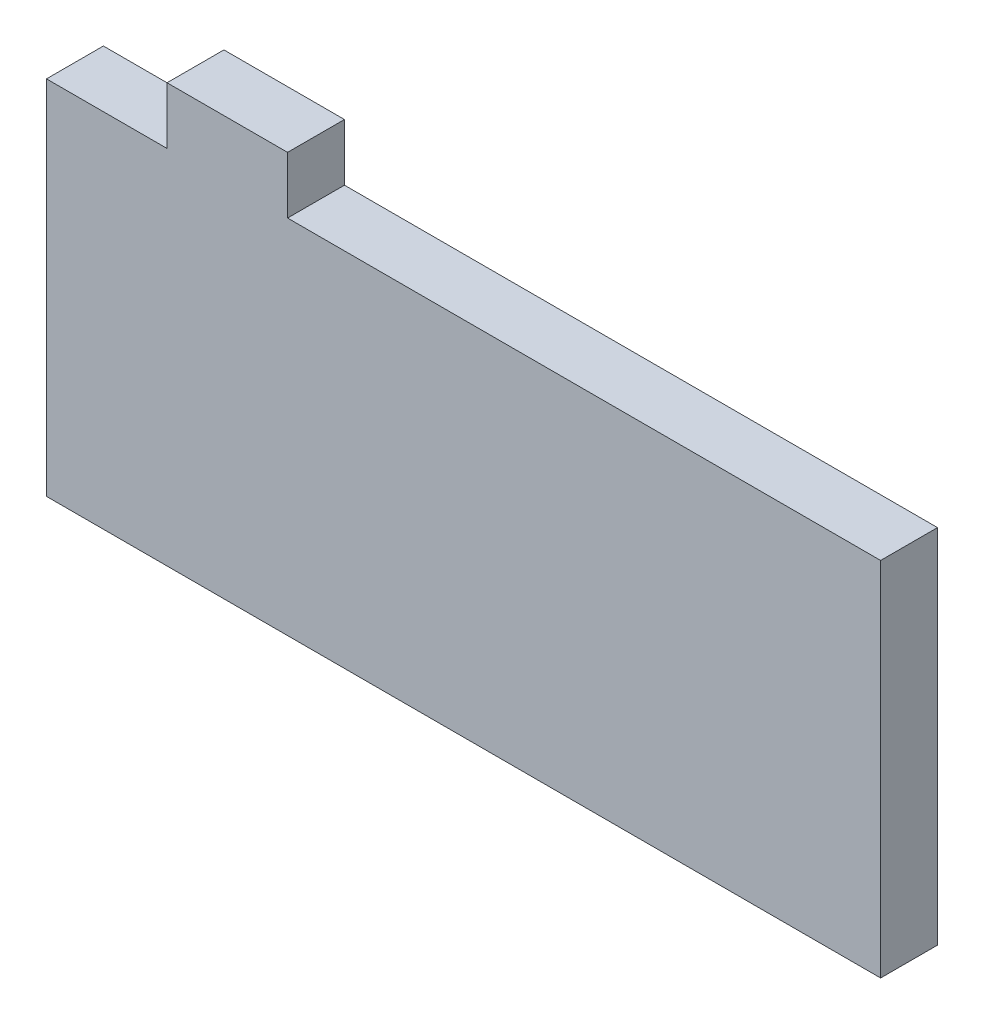
ISO-10303-21;
HEADER;
FILE_DESCRIPTION(('STEP AP214'),'2;1');
FILE_NAME('part.step','',(''),(''),'','','');
FILE_SCHEMA(('AUTOMOTIVE_DESIGN { 1 0 10303 214 1 1 1 1 }'));
ENDSEC;
DATA;
#1=APPLICATION_CONTEXT('core data for automotive mechanical design processes');
#2=APPLICATION_PROTOCOL_DEFINITION('international standard','automotive_design',2000,#1);
#3=PRODUCT_CONTEXT('',#1,'mechanical');
#4=PRODUCT('Part','Part','',(#3));
#5=PRODUCT_RELATED_PRODUCT_CATEGORY('part','',(#4));
#6=PRODUCT_DEFINITION_FORMATION('','',#4);
#7=PRODUCT_DEFINITION_CONTEXT('part definition',#1,'design');
#8=PRODUCT_DEFINITION('design','',#6,#7);
#9=PRODUCT_DEFINITION_SHAPE('','',#8);
#10=(LENGTH_UNIT() NAMED_UNIT(*) SI_UNIT(.MILLI.,.METRE.));
#11=(NAMED_UNIT(*) PLANE_ANGLE_UNIT() SI_UNIT($,.RADIAN.));
#12=(NAMED_UNIT(*) SI_UNIT($,.STERADIAN.) SOLID_ANGLE_UNIT());
#13=UNCERTAINTY_MEASURE_WITH_UNIT(LENGTH_MEASURE(1.E-05),#10,'distance_accuracy_value','');
#14=(GEOMETRIC_REPRESENTATION_CONTEXT(3) GLOBAL_UNCERTAINTY_ASSIGNED_CONTEXT((#13)) GLOBAL_UNIT_ASSIGNED_CONTEXT((#10,
#11,#12)) REPRESENTATION_CONTEXT('',''));
#15=CARTESIAN_POINT('',(0.,0.,0.));
#16=DIRECTION('',(0.,0.,1.));
#17=DIRECTION('',(1.,0.,0.));
#18=AXIS2_PLACEMENT_3D('',#15,#16,#17);
#19=CARTESIAN_POINT('',(-21.971,9.525,2.9972));
#20=DIRECTION('',(0.,-1.,0.));
#21=DIRECTION('',(0.,0.,-1.));
#22=AXIS2_PLACEMENT_3D('',#19,#20,#21);
#23=PLANE('',#22);
#24=DIRECTION('',(0.,0.,1.));
#25=VECTOR('',#24,1.);
#26=CARTESIAN_POINT('',(-15.621,9.525,0.));
#27=LINE('',#26,#25);
#28=CARTESIAN_POINT('',(-15.621,9.525,0.));
#29=VERTEX_POINT('',#28);
#30=CARTESIAN_POINT('',(-15.621,9.525,2.9972));
#31=VERTEX_POINT('',#30);
#32=EDGE_CURVE('E132',#29,#31,#27,.T.);
#33=ORIENTED_EDGE('',*,*,#32,.F.);
#34=DIRECTION('',(-1.,0.,0.));
#35=VECTOR('',#34,1.);
#36=CARTESIAN_POINT('',(-21.971,9.525,0.));
#37=LINE('',#36,#35);
#38=CARTESIAN_POINT('',(-21.971,9.525,0.));
#39=VERTEX_POINT('',#38);
#40=EDGE_CURVE('E136',#29,#39,#37,.T.);
#41=ORIENTED_EDGE('',*,*,#40,.T.);
#42=DIRECTION('',(0.,0.,-1.));
#43=VECTOR('',#42,1.);
#44=CARTESIAN_POINT('',(-21.971,9.525,2.9972));
#45=LINE('',#44,#43);
#46=CARTESIAN_POINT('',(-21.971,9.525,2.9972));
#47=VERTEX_POINT('',#46);
#48=EDGE_CURVE('E53',#47,#39,#45,.T.);
#49=ORIENTED_EDGE('',*,*,#48,.F.);
#50=DIRECTION('',(-1.,0.,0.));
#51=VECTOR('',#50,1.);
#52=CARTESIAN_POINT('',(-21.971,9.525,2.9972));
#53=LINE('',#52,#51);
#54=EDGE_CURVE('E60',#31,#47,#53,.T.);
#55=ORIENTED_EDGE('',*,*,#54,.F.);
#56=EDGE_LOOP('',(#33,#41,#49,#55));
#57=FACE_BOUND('',#56,.T.);
#58=ADVANCED_FACE('F45',(#57),#23,.F.);
#59=DIRECTION('',(0.,0.,-1.));
#60=VECTOR('',#59,1.);
#61=CARTESIAN_POINT('',(-9.271,9.525,0.));
#62=LINE('',#61,#60);
#63=CARTESIAN_POINT('',(-9.271,9.525,2.9972));
#64=VERTEX_POINT('',#63);
#65=CARTESIAN_POINT('',(-9.271,9.525,0.));
#66=VERTEX_POINT('',#65);
#67=EDGE_CURVE('E68',#64,#66,#62,.T.);
#68=ORIENTED_EDGE('',*,*,#67,.F.);
#69=CARTESIAN_POINT('',(21.971,9.525,2.9972));
#70=VERTEX_POINT('',#69);
#71=EDGE_CURVE('E145',#70,#64,#53,.T.);
#72=ORIENTED_EDGE('',*,*,#71,.F.);
#73=DIRECTION('',(0.,0.,-1.));
#74=VECTOR('',#73,1.);
#75=CARTESIAN_POINT('',(21.971,9.525,2.9972));
#76=LINE('',#75,#74);
#77=CARTESIAN_POINT('',(21.971,9.525,0.));
#78=VERTEX_POINT('',#77);
#79=EDGE_CURVE('E11',#70,#78,#76,.T.);
#80=ORIENTED_EDGE('',*,*,#79,.T.);
#81=EDGE_CURVE('E152',#78,#66,#37,.T.);
#82=ORIENTED_EDGE('',*,*,#81,.T.);
#83=EDGE_LOOP('',(#68,#72,#80,#82));
#84=FACE_BOUND('',#83,.T.);
#85=ADVANCED_FACE('F189',(#84),#23,.F.);
#86=CARTESIAN_POINT('',(21.971,-9.525,2.9972));
#87=DIRECTION('',(-1.,0.,0.));
#88=DIRECTION('',(0.,0.,1.));
#89=AXIS2_PLACEMENT_3D('',#86,#87,#88);
#90=PLANE('',#89);
#91=DIRECTION('',(0.,1.,0.));
#92=VECTOR('',#91,1.);
#93=CARTESIAN_POINT('',(21.971,-9.525,0.));
#94=LINE('',#93,#92);
#95=CARTESIAN_POINT('',(21.971,-9.525,0.));
#96=VERTEX_POINT('',#95);
#97=EDGE_CURVE('E133',#96,#78,#94,.T.);
#98=ORIENTED_EDGE('',*,*,#97,.T.);
#99=ORIENTED_EDGE('',*,*,#79,.F.);
#100=DIRECTION('',(0.,1.,0.));
#101=VECTOR('',#100,1.);
#102=CARTESIAN_POINT('',(21.971,-9.525,2.9972));
#103=LINE('',#102,#101);
#104=CARTESIAN_POINT('',(21.971,-9.525,2.9972));
#105=VERTEX_POINT('',#104);
#106=EDGE_CURVE('E142',#105,#70,#103,.T.);
#107=ORIENTED_EDGE('',*,*,#106,.F.);
#108=DIRECTION('',(0.,0.,-1.));
#109=VECTOR('',#108,1.);
#110=CARTESIAN_POINT('',(21.971,-9.525,2.9972));
#111=LINE('',#110,#109);
#112=EDGE_CURVE('E150',#105,#96,#111,.T.);
#113=ORIENTED_EDGE('',*,*,#112,.T.);
#114=EDGE_LOOP('',(#98,#99,#107,#113));
#115=FACE_BOUND('',#114,.T.);
#116=ADVANCED_FACE('F47',(#115),#90,.F.);
#117=CARTESIAN_POINT('',(-21.971,-9.525,2.9972));
#118=DIRECTION('',(1.,0.,0.));
#119=DIRECTION('',(0.,0.,-1.));
#120=AXIS2_PLACEMENT_3D('',#117,#118,#119);
#121=PLANE('',#120);
#122=DIRECTION('',(0.,-1.,0.));
#123=VECTOR('',#122,1.);
#124=CARTESIAN_POINT('',(-21.971,-9.525,0.));
#125=LINE('',#124,#123);
#126=CARTESIAN_POINT('',(-21.971,-9.525,0.));
#127=VERTEX_POINT('',#126);
#128=EDGE_CURVE('E154',#39,#127,#125,.T.);
#129=ORIENTED_EDGE('',*,*,#128,.T.);
#130=DIRECTION('',(0.,0.,-1.));
#131=VECTOR('',#130,1.);
#132=CARTESIAN_POINT('',(-21.971,-9.525,2.9972));
#133=LINE('',#132,#131);
#134=CARTESIAN_POINT('',(-21.971,-9.525,2.9972));
#135=VERTEX_POINT('',#134);
#136=EDGE_CURVE('E159',#135,#127,#133,.T.);
#137=ORIENTED_EDGE('',*,*,#136,.F.);
#138=DIRECTION('',(0.,-1.,0.));
#139=VECTOR('',#138,1.);
#140=CARTESIAN_POINT('',(-21.971,-9.525,2.9972));
#141=LINE('',#140,#139);
#142=EDGE_CURVE('E147',#47,#135,#141,.T.);
#143=ORIENTED_EDGE('',*,*,#142,.F.);
#144=ORIENTED_EDGE('',*,*,#48,.T.);
#145=EDGE_LOOP('',(#129,#137,#143,#144));
#146=FACE_BOUND('',#145,.T.);
#147=ADVANCED_FACE('F165',(#146),#121,.F.);
#148=CARTESIAN_POINT('',(-21.971,-9.525,2.9972));
#149=DIRECTION('',(0.,1.,0.));
#150=DIRECTION('',(0.,0.,1.));
#151=AXIS2_PLACEMENT_3D('',#148,#149,#150);
#152=PLANE('',#151);
#153=DIRECTION('',(1.,0.,0.));
#154=VECTOR('',#153,1.);
#155=CARTESIAN_POINT('',(-21.971,-9.525,0.));
#156=LINE('',#155,#154);
#157=EDGE_CURVE('E144',#127,#96,#156,.T.);
#158=ORIENTED_EDGE('',*,*,#157,.T.);
#159=ORIENTED_EDGE('',*,*,#112,.F.);
#160=DIRECTION('',(1.,0.,0.));
#161=VECTOR('',#160,1.);
#162=CARTESIAN_POINT('',(-21.971,-9.525,2.9972));
#163=LINE('',#162,#161);
#164=EDGE_CURVE('E149',#135,#105,#163,.T.);
#165=ORIENTED_EDGE('',*,*,#164,.F.);
#166=ORIENTED_EDGE('',*,*,#136,.T.);
#167=EDGE_LOOP('',(#158,#159,#165,#166));
#168=FACE_BOUND('',#167,.T.);
#169=ADVANCED_FACE('F174',(#168),#152,.F.);
#170=CARTESIAN_POINT('',(0.,0.,2.9972));
#171=DIRECTION('',(0.,0.,-1.));
#172=DIRECTION('',(-1.,0.,0.));
#173=AXIS2_PLACEMENT_3D('',#170,#171,#172);
#174=PLANE('',#173);
#175=ORIENTED_EDGE('',*,*,#106,.T.);
#176=ORIENTED_EDGE('',*,*,#71,.T.);
#177=DIRECTION('',(0.,-1.,0.));
#178=VECTOR('',#177,1.);
#179=CARTESIAN_POINT('',(-9.271,12.5222,2.9972));
#180=LINE('',#179,#178);
#181=CARTESIAN_POINT('',(-9.271,12.5222,2.9972));
#182=VERTEX_POINT('',#181);
#183=EDGE_CURVE('E117',#182,#64,#180,.T.);
#184=ORIENTED_EDGE('',*,*,#183,.F.);
#185=DIRECTION('',(1.,0.,0.));
#186=VECTOR('',#185,1.);
#187=CARTESIAN_POINT('',(-15.621,12.5222,2.9972));
#188=LINE('',#187,#186);
#189=CARTESIAN_POINT('',(-15.621,12.5222,2.9972));
#190=VERTEX_POINT('',#189);
#191=EDGE_CURVE('E109',#190,#182,#188,.T.);
#192=ORIENTED_EDGE('',*,*,#191,.F.);
#193=DIRECTION('',(0.,-1.,0.));
#194=VECTOR('',#193,1.);
#195=CARTESIAN_POINT('',(-15.621,12.5222,2.9972));
#196=LINE('',#195,#194);
#197=EDGE_CURVE('E114',#190,#31,#196,.T.);
#198=ORIENTED_EDGE('',*,*,#197,.T.);
#199=ORIENTED_EDGE('',*,*,#54,.T.);
#200=ORIENTED_EDGE('',*,*,#142,.T.);
#201=ORIENTED_EDGE('',*,*,#164,.T.);
#202=EDGE_LOOP('',(#175,#176,#184,#192,#198,#199,#200,#201));
#203=FACE_BOUND('',#202,.T.);
#204=ADVANCED_FACE('F112',(#203),#174,.F.);
#205=CARTESIAN_POINT('',(0.,0.,0.));
#206=DIRECTION('',(0.,0.,-1.));
#207=DIRECTION('',(-1.,0.,0.));
#208=AXIS2_PLACEMENT_3D('',#205,#206,#207);
#209=PLANE('',#208);
#210=ORIENTED_EDGE('',*,*,#97,.F.);
#211=ORIENTED_EDGE('',*,*,#157,.F.);
#212=ORIENTED_EDGE('',*,*,#128,.F.);
#213=ORIENTED_EDGE('',*,*,#40,.F.);
#214=DIRECTION('',(0.,-1.,0.));
#215=VECTOR('',#214,1.);
#216=CARTESIAN_POINT('',(-15.621,12.5222,0.));
#217=LINE('',#216,#215);
#218=CARTESIAN_POINT('',(-15.621,12.5222,0.));
#219=VERTEX_POINT('',#218);
#220=EDGE_CURVE('E184',#219,#29,#217,.T.);
#221=ORIENTED_EDGE('',*,*,#220,.F.);
#222=DIRECTION('',(-1.,0.,0.));
#223=VECTOR('',#222,1.);
#224=CARTESIAN_POINT('',(-15.621,12.5222,0.));
#225=LINE('',#224,#223);
#226=CARTESIAN_POINT('',(-9.271,12.5222,0.));
#227=VERTEX_POINT('',#226);
#228=EDGE_CURVE('E126',#227,#219,#225,.T.);
#229=ORIENTED_EDGE('',*,*,#228,.F.);
#230=DIRECTION('',(0.,-1.,0.));
#231=VECTOR('',#230,1.);
#232=CARTESIAN_POINT('',(-9.271,12.5222,0.));
#233=LINE('',#232,#231);
#234=EDGE_CURVE('E138',#227,#66,#233,.T.);
#235=ORIENTED_EDGE('',*,*,#234,.T.);
#236=ORIENTED_EDGE('',*,*,#81,.F.);
#237=EDGE_LOOP('',(#210,#211,#212,#213,#221,#229,#235,#236));
#238=FACE_BOUND('',#237,.T.);
#239=ADVANCED_FACE('F171',(#238),#209,.T.);
#240=CARTESIAN_POINT('',(-15.621,12.5222,0.));
#241=DIRECTION('',(1.,0.,0.));
#242=DIRECTION('',(0.,0.,-1.));
#243=AXIS2_PLACEMENT_3D('',#240,#241,#242);
#244=PLANE('',#243);
#245=ORIENTED_EDGE('',*,*,#32,.T.);
#246=ORIENTED_EDGE('',*,*,#197,.F.);
#247=DIRECTION('',(0.,0.,1.));
#248=VECTOR('',#247,1.);
#249=CARTESIAN_POINT('',(-15.621,12.5222,0.));
#250=LINE('',#249,#248);
#251=EDGE_CURVE('E121',#219,#190,#250,.T.);
#252=ORIENTED_EDGE('',*,*,#251,.F.);
#253=ORIENTED_EDGE('',*,*,#220,.T.);
#254=EDGE_LOOP('',(#245,#246,#252,#253));
#255=FACE_BOUND('',#254,.T.);
#256=ADVANCED_FACE('F131',(#255),#244,.F.);
#257=CARTESIAN_POINT('',(-9.271,12.5222,0.));
#258=DIRECTION('',(-1.,0.,0.));
#259=DIRECTION('',(0.,0.,1.));
#260=AXIS2_PLACEMENT_3D('',#257,#258,#259);
#261=PLANE('',#260);
#262=ORIENTED_EDGE('',*,*,#67,.T.);
#263=ORIENTED_EDGE('',*,*,#234,.F.);
#264=DIRECTION('',(0.,0.,-1.));
#265=VECTOR('',#264,1.);
#266=CARTESIAN_POINT('',(-9.271,12.5222,0.));
#267=LINE('',#266,#265);
#268=EDGE_CURVE('E120',#182,#227,#267,.T.);
#269=ORIENTED_EDGE('',*,*,#268,.F.);
#270=ORIENTED_EDGE('',*,*,#183,.T.);
#271=EDGE_LOOP('',(#262,#263,#269,#270));
#272=FACE_BOUND('',#271,.T.);
#273=ADVANCED_FACE('F180',(#272),#261,.F.);
#274=CARTESIAN_POINT('',(0.,12.5222,0.));
#275=DIRECTION('',(0.,1.,0.));
#276=DIRECTION('',(0.,0.,1.));
#277=AXIS2_PLACEMENT_3D('',#274,#275,#276);
#278=PLANE('',#277);
#279=ORIENTED_EDGE('',*,*,#251,.T.);
#280=ORIENTED_EDGE('',*,*,#191,.T.);
#281=ORIENTED_EDGE('',*,*,#268,.T.);
#282=ORIENTED_EDGE('',*,*,#228,.T.);
#283=EDGE_LOOP('',(#279,#280,#281,#282));
#284=FACE_BOUND('',#283,.T.);
#285=ADVANCED_FACE('F124',(#284),#278,.T.);
#286=CLOSED_SHELL('',(#58,#85,#116,#147,#169,#204,#239,#256,#273,#285));
#287=MANIFOLD_SOLID_BREP('B2',#286);
#288=ADVANCED_BREP_SHAPE_REPRESENTATION('',(#18,#287),#14);
#289=SHAPE_DEFINITION_REPRESENTATION(#9,#288);
ENDSEC;
END-ISO-10303-21;
